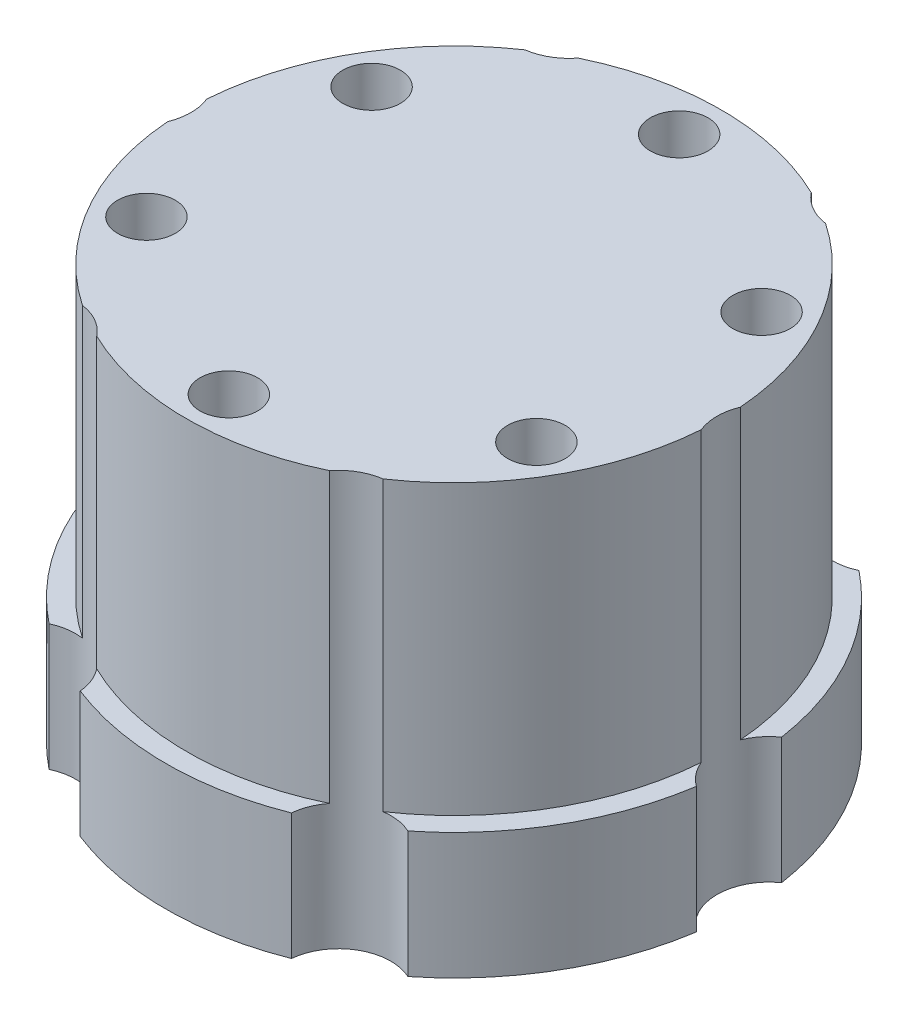
ISO-10303-21;
HEADER;
FILE_DESCRIPTION(('STEP AP214'),'2;1');
FILE_NAME('part.step','',(''),(''),'','','');
FILE_SCHEMA(('AUTOMOTIVE_DESIGN { 1 0 10303 214 1 1 1 1 }'));
ENDSEC;
DATA;
#1=APPLICATION_CONTEXT('core data for automotive mechanical design processes');
#2=APPLICATION_PROTOCOL_DEFINITION('international standard','automotive_design',2000,#1);
#3=PRODUCT_CONTEXT('',#1,'mechanical');
#4=PRODUCT('Part','Part','',(#3));
#5=PRODUCT_RELATED_PRODUCT_CATEGORY('part','',(#4));
#6=PRODUCT_DEFINITION_FORMATION('','',#4);
#7=PRODUCT_DEFINITION_CONTEXT('part definition',#1,'design');
#8=PRODUCT_DEFINITION('design','',#6,#7);
#9=PRODUCT_DEFINITION_SHAPE('','',#8);
#10=(LENGTH_UNIT() NAMED_UNIT(*) SI_UNIT(.MILLI.,.METRE.));
#11=(NAMED_UNIT(*) PLANE_ANGLE_UNIT() SI_UNIT($,.RADIAN.));
#12=(NAMED_UNIT(*) SI_UNIT($,.STERADIAN.) SOLID_ANGLE_UNIT());
#13=UNCERTAINTY_MEASURE_WITH_UNIT(LENGTH_MEASURE(1.E-05),#10,'distance_accuracy_value','');
#14=(GEOMETRIC_REPRESENTATION_CONTEXT(3) GLOBAL_UNCERTAINTY_ASSIGNED_CONTEXT((#13)) GLOBAL_UNIT_ASSIGNED_CONTEXT((#10,
#11,#12)) REPRESENTATION_CONTEXT('',''));
#15=CARTESIAN_POINT('',(0.,0.,0.));
#16=DIRECTION('',(0.,0.,1.));
#17=DIRECTION('',(1.,0.,0.));
#18=AXIS2_PLACEMENT_3D('',#15,#16,#17);
#19=CARTESIAN_POINT('',(0.,7.,0.));
#20=DIRECTION('',(0.,-1.,0.));
#21=DIRECTION('',(0.,0.,-1.));
#22=AXIS2_PLACEMENT_3D('',#19,#20,#21);
#23=CYLINDRICAL_SURFACE('',#22,16.);
#24=CARTESIAN_POINT('',(0.,0.,0.));
#25=DIRECTION('',(0.,1.,0.));
#26=DIRECTION('',(0.,0.,1.));
#27=AXIS2_PLACEMENT_3D('',#24,#25,#26);
#28=CIRCLE('',#27,16.);
#29=CARTESIAN_POINT('',(-15.824,0.,2.36664826283945));
#30=VERTEX_POINT('',#29);
#31=CARTESIAN_POINT('',(-9.96157751744089,0.,12.5206618580655));
#32=VERTEX_POINT('',#31);
#33=EDGE_CURVE('E242',#30,#32,#28,.T.);
#34=ORIENTED_EDGE('',*,*,#33,.T.);
#35=DIRECTION('',(0.,-1.,0.));
#36=VECTOR('',#35,1.);
#37=CARTESIAN_POINT('',(-9.96157751744089,11.5,12.5206618580655));
#38=LINE('',#37,#36);
#39=CARTESIAN_POINT('',(-9.96157751744088,7.,12.5206618580655));
#40=VERTEX_POINT('',#39);
#41=EDGE_CURVE('E287',#32,#40,#38,.F.);
#42=ORIENTED_EDGE('',*,*,#41,.T.);
#43=CARTESIAN_POINT('',(0.,7.,0.));
#44=DIRECTION('',(0.,1.,0.));
#45=DIRECTION('',(0.,0.,1.));
#46=AXIS2_PLACEMENT_3D('',#43,#44,#45);
#47=CIRCLE('',#46,16.);
#48=CARTESIAN_POINT('',(-15.824,7.,2.36664826283945));
#49=VERTEX_POINT('',#48);
#50=EDGE_CURVE('E404',#49,#40,#47,.T.);
#51=ORIENTED_EDGE('',*,*,#50,.F.);
#52=DIRECTION('',(0.,-1.,0.));
#53=VECTOR('',#52,1.);
#54=CARTESIAN_POINT('',(-15.824,11.5,2.36664826283945));
#55=LINE('',#54,#53);
#56=EDGE_CURVE('E267',#49,#30,#55,.T.);
#57=ORIENTED_EDGE('',*,*,#56,.T.);
#58=EDGE_LOOP('',(#34,#42,#51,#57));
#59=FACE_BOUND('',#58,.T.);
#60=ADVANCED_FACE('F41',(#59),#23,.T.);
#61=CARTESIAN_POINT('',(-9.96157751744123,0.,-12.5206618580652));
#62=VERTEX_POINT('',#61);
#63=CARTESIAN_POINT('',(-15.824,0.,-2.36664826283902));
#64=VERTEX_POINT('',#63);
#65=EDGE_CURVE('E412',#62,#64,#28,.T.);
#66=ORIENTED_EDGE('',*,*,#65,.T.);
#67=DIRECTION('',(0.,-1.,0.));
#68=VECTOR('',#67,1.);
#69=CARTESIAN_POINT('',(-15.824,11.5,-2.36664826283902));
#70=LINE('',#69,#68);
#71=CARTESIAN_POINT('',(-15.824,7.,-2.36664826283901));
#72=VERTEX_POINT('',#71);
#73=EDGE_CURVE('E269',#64,#72,#70,.F.);
#74=ORIENTED_EDGE('',*,*,#73,.T.);
#75=CARTESIAN_POINT('',(-9.96157751744122,7.,-12.5206618580652));
#76=VERTEX_POINT('',#75);
#77=EDGE_CURVE('E498',#76,#72,#47,.T.);
#78=ORIENTED_EDGE('',*,*,#77,.F.);
#79=DIRECTION('',(0.,-1.,0.));
#80=VECTOR('',#79,1.);
#81=CARTESIAN_POINT('',(-9.96157751744123,11.5,-12.5206618580652));
#82=LINE('',#81,#80);
#83=EDGE_CURVE('E470',#76,#62,#82,.T.);
#84=ORIENTED_EDGE('',*,*,#83,.T.);
#85=EDGE_LOOP('',(#66,#74,#78,#84));
#86=FACE_BOUND('',#85,.T.);
#87=ADVANCED_FACE('F355',(#86),#23,.T.);
#88=CARTESIAN_POINT('',(5.86242248255877,0.,-14.8873101209046));
#89=VERTEX_POINT('',#88);
#90=CARTESIAN_POINT('',(-5.86242248255907,0.,-14.8873101209045));
#91=VERTEX_POINT('',#90);
#92=EDGE_CURVE('E407',#89,#91,#28,.T.);
#93=ORIENTED_EDGE('',*,*,#92,.T.);
#94=DIRECTION('',(0.,-1.,0.));
#95=VECTOR('',#94,1.);
#96=CARTESIAN_POINT('',(-5.86242248255907,11.5,-14.8873101209045));
#97=LINE('',#96,#95);
#98=CARTESIAN_POINT('',(-5.86242248255908,7.,-14.8873101209045));
#99=VERTEX_POINT('',#98);
#100=EDGE_CURVE('E476',#91,#99,#97,.F.);
#101=ORIENTED_EDGE('',*,*,#100,.T.);
#102=CARTESIAN_POINT('',(5.86242248255878,7.,-14.8873101209046));
#103=VERTEX_POINT('',#102);
#104=EDGE_CURVE('E492',#103,#99,#47,.T.);
#105=ORIENTED_EDGE('',*,*,#104,.F.);
#106=DIRECTION('',(0.,-1.,0.));
#107=VECTOR('',#106,1.);
#108=CARTESIAN_POINT('',(5.86242248255877,11.5,-14.8873101209046));
#109=LINE('',#108,#107);
#110=EDGE_CURVE('E459',#103,#89,#109,.T.);
#111=ORIENTED_EDGE('',*,*,#110,.T.);
#112=EDGE_LOOP('',(#93,#101,#105,#111));
#113=FACE_BOUND('',#112,.T.);
#114=ADVANCED_FACE('F361',(#113),#23,.T.);
#115=CARTESIAN_POINT('',(15.824,0.,-2.36664826283935));
#116=VERTEX_POINT('',#115);
#117=CARTESIAN_POINT('',(9.96157751744098,0.,-12.5206618580654));
#118=VERTEX_POINT('',#117);
#119=EDGE_CURVE('E402',#116,#118,#28,.T.);
#120=ORIENTED_EDGE('',*,*,#119,.T.);
#121=DIRECTION('',(0.,-1.,0.));
#122=VECTOR('',#121,1.);
#123=CARTESIAN_POINT('',(9.96157751744098,11.5,-12.5206618580654));
#124=LINE('',#123,#122);
#125=CARTESIAN_POINT('',(9.96157751744097,7.,-12.5206618580654));
#126=VERTEX_POINT('',#125);
#127=EDGE_CURVE('E465',#118,#126,#124,.F.);
#128=ORIENTED_EDGE('',*,*,#127,.T.);
#129=CARTESIAN_POINT('',(15.824,7.,-2.36664826283934));
#130=VERTEX_POINT('',#129);
#131=EDGE_CURVE('E488',#130,#126,#47,.T.);
#132=ORIENTED_EDGE('',*,*,#131,.F.);
#133=DIRECTION('',(0.,-1.,0.));
#134=VECTOR('',#133,1.);
#135=CARTESIAN_POINT('',(15.824,11.5,-2.36664826283935));
#136=LINE('',#135,#134);
#137=EDGE_CURVE('E447',#130,#116,#136,.T.);
#138=ORIENTED_EDGE('',*,*,#137,.T.);
#139=EDGE_LOOP('',(#120,#128,#132,#138));
#140=FACE_BOUND('',#139,.T.);
#141=ADVANCED_FACE('F382',(#140),#23,.T.);
#142=CARTESIAN_POINT('',(9.96157751744114,0.,12.5206618580653));
#143=VERTEX_POINT('',#142);
#144=CARTESIAN_POINT('',(15.824,0.,2.36664826283913));
#145=VERTEX_POINT('',#144);
#146=EDGE_CURVE('E243',#143,#145,#28,.T.);
#147=ORIENTED_EDGE('',*,*,#146,.T.);
#148=DIRECTION('',(0.,-1.,0.));
#149=VECTOR('',#148,1.);
#150=CARTESIAN_POINT('',(15.824,11.5,2.36664826283913));
#151=LINE('',#150,#149);
#152=CARTESIAN_POINT('',(15.824,7.,2.36664826283912));
#153=VERTEX_POINT('',#152);
#154=EDGE_CURVE('E396',#145,#153,#151,.F.);
#155=ORIENTED_EDGE('',*,*,#154,.T.);
#156=CARTESIAN_POINT('',(9.96157751744114,7.,12.5206618580653));
#157=VERTEX_POINT('',#156);
#158=EDGE_CURVE('E405',#157,#153,#47,.T.);
#159=ORIENTED_EDGE('',*,*,#158,.F.);
#160=DIRECTION('',(0.,-1.,0.));
#161=VECTOR('',#160,1.);
#162=CARTESIAN_POINT('',(9.96157751744114,11.5,12.5206618580653));
#163=LINE('',#162,#161);
#164=EDGE_CURVE('E224',#157,#143,#163,.T.);
#165=ORIENTED_EDGE('',*,*,#164,.T.);
#166=EDGE_LOOP('',(#147,#155,#159,#165));
#167=FACE_BOUND('',#166,.T.);
#168=ADVANCED_FACE('F368',(#167),#23,.T.);
#169=CARTESIAN_POINT('',(0.,7.,0.));
#170=DIRECTION('',(0.,1.,0.));
#171=DIRECTION('',(0.,0.,1.));
#172=AXIS2_PLACEMENT_3D('',#169,#170,#171);
#173=PLANE('',#172);
#174=CARTESIAN_POINT('',(-8.74999999999975,7.,15.1554445662278));
#175=DIRECTION('',(0.,1.,0.));
#176=DIRECTION('',(0.,0.,1.));
#177=AXIS2_PLACEMENT_3D('',#174,#175,#176);
#178=CIRCLE('',#177,2.9);
#179=CARTESIAN_POINT('',(-5.86242248255867,7.,14.8873101209047));
#180=VERTEX_POINT('',#179);
#181=CARTESIAN_POINT('',(-6.46610137770818,7.,13.3683219954189));
#182=VERTEX_POINT('',#181);
#183=EDGE_CURVE('E278',#180,#182,#178,.T.);
#184=ORIENTED_EDGE('',*,*,#183,.F.);
#185=CARTESIAN_POINT('',(5.86242248255898,7.,14.8873101209045));
#186=VERTEX_POINT('',#185);
#187=EDGE_CURVE('E401',#180,#186,#47,.T.);
#188=ORIENTED_EDGE('',*,*,#187,.T.);
#189=CARTESIAN_POINT('',(8.75000000000007,7.,15.1554445662276));
#190=DIRECTION('',(0.,1.,0.));
#191=DIRECTION('',(0.,0.,1.));
#192=AXIS2_PLACEMENT_3D('',#189,#190,#191);
#193=CIRCLE('',#192,2.9);
#194=CARTESIAN_POINT('',(6.4661013777085,7.,13.3683219954187));
#195=VERTEX_POINT('',#194);
#196=EDGE_CURVE('E223',#195,#186,#193,.T.);
#197=ORIENTED_EDGE('',*,*,#196,.F.);
#198=CARTESIAN_POINT('',(0.,7.,0.));
#199=DIRECTION('',(0.,1.,0.));
#200=DIRECTION('',(0.,0.,1.));
#201=AXIS2_PLACEMENT_3D('',#198,#199,#200);
#202=CIRCLE('',#201,14.85);
#203=EDGE_CURVE('E52',#182,#195,#202,.T.);
#204=ORIENTED_EDGE('',*,*,#203,.F.);
#205=EDGE_LOOP('',(#184,#188,#197,#204));
#206=FACE_BOUND('',#205,.T.);
#207=ADVANCED_FACE('F375',(#206),#173,.T.);
#208=CARTESIAN_POINT('',(-8.34425576514854,7.,12.2839690542506));
#209=VERTEX_POINT('',#208);
#210=EDGE_CURVE('E281',#209,#40,#178,.T.);
#211=ORIENTED_EDGE('',*,*,#210,.F.);
#212=CARTESIAN_POINT('',(-14.8103571428571,7.,1.08435294116852));
#213=VERTEX_POINT('',#212);
#214=EDGE_CURVE('E485',#213,#209,#202,.T.);
#215=ORIENTED_EDGE('',*,*,#214,.F.);
#216=CARTESIAN_POINT('',(-17.5,7.,2.39391839684799E-13));
#217=DIRECTION('',(0.,1.,0.));
#218=DIRECTION('',(0.,0.,1.));
#219=AXIS2_PLACEMENT_3D('',#216,#217,#218);
#220=CIRCLE('',#219,2.9);
#221=EDGE_CURVE('E271',#49,#213,#220,.T.);
#222=ORIENTED_EDGE('',*,*,#221,.F.);
#223=ORIENTED_EDGE('',*,*,#50,.T.);
#224=EDGE_LOOP('',(#211,#215,#222,#223));
#225=FACE_BOUND('',#224,.T.);
#226=ADVANCED_FACE('F388',(#225),#173,.T.);
#227=CARTESIAN_POINT('',(-8.75000000000017,7.,-15.1554445662276));
#228=DIRECTION('',(0.,1.,0.));
#229=DIRECTION('',(0.,0.,1.));
#230=AXIS2_PLACEMENT_3D('',#227,#228,#229);
#231=CIRCLE('',#230,2.9);
#232=CARTESIAN_POINT('',(-6.4661013777086,7.,-13.3683219954187));
#233=VERTEX_POINT('',#232);
#234=EDGE_CURVE('E471',#233,#99,#231,.T.);
#235=ORIENTED_EDGE('',*,*,#234,.F.);
#236=CARTESIAN_POINT('',(6.46610137770832,7.,-13.3683219954188));
#237=VERTEX_POINT('',#236);
#238=EDGE_CURVE('E487',#237,#233,#202,.T.);
#239=ORIENTED_EDGE('',*,*,#238,.F.);
#240=CARTESIAN_POINT('',(8.74999999999986,7.,-15.1554445662278));
#241=DIRECTION('',(0.,1.,0.));
#242=DIRECTION('',(0.,0.,1.));
#243=AXIS2_PLACEMENT_3D('',#240,#241,#242);
#244=CIRCLE('',#243,2.9);
#245=EDGE_CURVE('E457',#103,#237,#244,.T.);
#246=ORIENTED_EDGE('',*,*,#245,.F.);
#247=ORIENTED_EDGE('',*,*,#104,.T.);
#248=EDGE_LOOP('',(#235,#239,#246,#247));
#249=FACE_BOUND('',#248,.T.);
#250=ADVANCED_FACE('F528',(#249),#173,.T.);
#251=CARTESIAN_POINT('',(-14.8103571428572,7.,-1.08435294116811));
#252=VERTEX_POINT('',#251);
#253=EDGE_CURVE('E266',#252,#72,#220,.T.);
#254=ORIENTED_EDGE('',*,*,#253,.F.);
#255=CARTESIAN_POINT('',(-8.34425576514885,7.,-12.2839690542504));
#256=VERTEX_POINT('',#255);
#257=EDGE_CURVE('E264',#256,#252,#202,.T.);
#258=ORIENTED_EDGE('',*,*,#257,.F.);
#259=EDGE_CURVE('E468',#76,#256,#231,.T.);
#260=ORIENTED_EDGE('',*,*,#259,.F.);
#261=ORIENTED_EDGE('',*,*,#77,.T.);
#262=EDGE_LOOP('',(#254,#258,#260,#261));
#263=FACE_BOUND('',#262,.T.);
#264=ADVANCED_FACE('F507',(#263),#173,.T.);
#265=CARTESIAN_POINT('',(8.3442557651486,7.,-12.2839690542505));
#266=VERTEX_POINT('',#265);
#267=EDGE_CURVE('E460',#266,#126,#244,.T.);
#268=ORIENTED_EDGE('',*,*,#267,.F.);
#269=CARTESIAN_POINT('',(14.8103571428571,7.,-1.08435294116842));
#270=VERTEX_POINT('',#269);
#271=EDGE_CURVE('E50',#270,#266,#202,.T.);
#272=ORIENTED_EDGE('',*,*,#271,.F.);
#273=CARTESIAN_POINT('',(17.5,7.,-1.18828558104411E-13));
#274=DIRECTION('',(0.,1.,0.));
#275=DIRECTION('',(0.,0.,1.));
#276=AXIS2_PLACEMENT_3D('',#273,#274,#275);
#277=CIRCLE('',#276,2.9);
#278=EDGE_CURVE('E445',#130,#270,#277,.T.);
#279=ORIENTED_EDGE('',*,*,#278,.F.);
#280=ORIENTED_EDGE('',*,*,#131,.T.);
#281=EDGE_LOOP('',(#268,#272,#279,#280));
#282=FACE_BOUND('',#281,.T.);
#283=ADVANCED_FACE('F376',(#282),#173,.T.);
#284=CARTESIAN_POINT('',(0.,23.,0.));
#285=DIRECTION('',(0.,-1.,0.));
#286=DIRECTION('',(0.,0.,-1.));
#287=AXIS2_PLACEMENT_3D('',#284,#285,#286);
#288=CYLINDRICAL_SURFACE('',#287,14.85);
#289=ORIENTED_EDGE('',*,*,#214,.T.);
#290=DIRECTION('',(0.,-1.,0.));
#291=VECTOR('',#290,1.);
#292=CARTESIAN_POINT('',(-8.34425576514855,11.5,12.2839690542506));
#293=LINE('',#292,#291);
#294=CARTESIAN_POINT('',(-8.34425576514855,23.,12.2839690542506));
#295=VERTEX_POINT('',#294);
#296=EDGE_CURVE('E284',#209,#295,#293,.F.);
#297=ORIENTED_EDGE('',*,*,#296,.T.);
#298=CARTESIAN_POINT('',(0.,23.,0.));
#299=DIRECTION('',(0.,1.,0.));
#300=DIRECTION('',(0.,0.,1.));
#301=AXIS2_PLACEMENT_3D('',#298,#299,#300);
#302=CIRCLE('',#301,14.85);
#303=CARTESIAN_POINT('',(-14.8103571428571,23.,1.08435294116852));
#304=VERTEX_POINT('',#303);
#305=EDGE_CURVE('E230',#304,#295,#302,.T.);
#306=ORIENTED_EDGE('',*,*,#305,.F.);
#307=DIRECTION('',(0.,-1.,0.));
#308=VECTOR('',#307,1.);
#309=CARTESIAN_POINT('',(-14.8103571428571,11.5,1.08435294116852));
#310=LINE('',#309,#308);
#311=EDGE_CURVE('E67',#304,#213,#310,.T.);
#312=ORIENTED_EDGE('',*,*,#311,.T.);
#313=EDGE_LOOP('',(#289,#297,#306,#312));
#314=FACE_BOUND('',#313,.T.);
#315=ADVANCED_FACE('F484',(#314),#288,.T.);
#316=ORIENTED_EDGE('',*,*,#257,.T.);
#317=DIRECTION('',(0.,-1.,0.));
#318=VECTOR('',#317,1.);
#319=CARTESIAN_POINT('',(-14.8103571428572,11.5,-1.08435294116811));
#320=LINE('',#319,#318);
#321=CARTESIAN_POINT('',(-14.8103571428572,23.,-1.08435294116811));
#322=VERTEX_POINT('',#321);
#323=EDGE_CURVE('E263',#252,#322,#320,.F.);
#324=ORIENTED_EDGE('',*,*,#323,.T.);
#325=CARTESIAN_POINT('',(-8.34425576514884,23.,-12.2839690542504));
#326=VERTEX_POINT('',#325);
#327=EDGE_CURVE('E234',#326,#322,#302,.T.);
#328=ORIENTED_EDGE('',*,*,#327,.F.);
#329=DIRECTION('',(0.,-1.,0.));
#330=VECTOR('',#329,1.);
#331=CARTESIAN_POINT('',(-8.34425576514884,11.5,-12.2839690542503));
#332=LINE('',#331,#330);
#333=EDGE_CURVE('E261',#326,#256,#332,.T.);
#334=ORIENTED_EDGE('',*,*,#333,.T.);
#335=EDGE_LOOP('',(#316,#324,#328,#334));
#336=FACE_BOUND('',#335,.T.);
#337=ADVANCED_FACE('F260',(#336),#288,.T.);
#338=ORIENTED_EDGE('',*,*,#238,.T.);
#339=DIRECTION('',(0.,-1.,0.));
#340=VECTOR('',#339,1.);
#341=CARTESIAN_POINT('',(-6.46610137770859,11.5,-13.3683219954187));
#342=LINE('',#341,#340);
#343=CARTESIAN_POINT('',(-6.46610137770859,23.,-13.3683219954187));
#344=VERTEX_POINT('',#343);
#345=EDGE_CURVE('E473',#233,#344,#342,.F.);
#346=ORIENTED_EDGE('',*,*,#345,.T.);
#347=CARTESIAN_POINT('',(6.46610137770832,23.,-13.3683219954188));
#348=VERTEX_POINT('',#347);
#349=EDGE_CURVE('E245',#348,#344,#302,.T.);
#350=ORIENTED_EDGE('',*,*,#349,.F.);
#351=DIRECTION('',(0.,-1.,0.));
#352=VECTOR('',#351,1.);
#353=CARTESIAN_POINT('',(6.46610137770831,11.5,-13.3683219954188));
#354=LINE('',#353,#352);
#355=EDGE_CURVE('E454',#348,#237,#354,.T.);
#356=ORIENTED_EDGE('',*,*,#355,.T.);
#357=EDGE_LOOP('',(#338,#346,#350,#356));
#358=FACE_BOUND('',#357,.T.);
#359=ADVANCED_FACE('F530',(#358),#288,.T.);
#360=ORIENTED_EDGE('',*,*,#271,.T.);
#361=DIRECTION('',(0.,-1.,0.));
#362=VECTOR('',#361,1.);
#363=CARTESIAN_POINT('',(8.34425576514859,11.5,-12.2839690542505));
#364=LINE('',#363,#362);
#365=CARTESIAN_POINT('',(8.34425576514859,23.,-12.2839690542505));
#366=VERTEX_POINT('',#365);
#367=EDGE_CURVE('E462',#266,#366,#364,.F.);
#368=ORIENTED_EDGE('',*,*,#367,.T.);
#369=CARTESIAN_POINT('',(14.8103571428571,23.,-1.08435294116841));
#370=VERTEX_POINT('',#369);
#371=EDGE_CURVE('E239',#370,#366,#302,.T.);
#372=ORIENTED_EDGE('',*,*,#371,.F.);
#373=DIRECTION('',(0.,-1.,0.));
#374=VECTOR('',#373,1.);
#375=CARTESIAN_POINT('',(14.8103571428571,11.5,-1.08435294116842));
#376=LINE('',#375,#374);
#377=EDGE_CURVE('E442',#370,#270,#376,.T.);
#378=ORIENTED_EDGE('',*,*,#377,.T.);
#379=EDGE_LOOP('',(#360,#368,#372,#378));
#380=FACE_BOUND('',#379,.T.);
#381=ADVANCED_FACE('F377',(#380),#288,.T.);
#382=CARTESIAN_POINT('',(8.34425576514877,7.,12.2839690542504));
#383=VERTEX_POINT('',#382);
#384=CARTESIAN_POINT('',(14.8103571428572,7.,1.08435294116822));
#385=VERTEX_POINT('',#384);
#386=EDGE_CURVE('E11',#383,#385,#202,.T.);
#387=ORIENTED_EDGE('',*,*,#386,.T.);
#388=DIRECTION('',(0.,-1.,0.));
#389=VECTOR('',#388,1.);
#390=CARTESIAN_POINT('',(14.8103571428571,11.5,1.08435294116822));
#391=LINE('',#390,#389);
#392=CARTESIAN_POINT('',(14.8103571428571,23.,1.08435294116822));
#393=VERTEX_POINT('',#392);
#394=EDGE_CURVE('E450',#385,#393,#391,.F.);
#395=ORIENTED_EDGE('',*,*,#394,.T.);
#396=CARTESIAN_POINT('',(8.34425576514876,23.,12.2839690542504));
#397=VERTEX_POINT('',#396);
#398=EDGE_CURVE('E233',#397,#393,#302,.T.);
#399=ORIENTED_EDGE('',*,*,#398,.F.);
#400=DIRECTION('',(0.,-1.,0.));
#401=VECTOR('',#400,1.);
#402=CARTESIAN_POINT('',(8.34425576514876,11.5,12.2839690542504));
#403=LINE('',#402,#401);
#404=EDGE_CURVE('E210',#397,#383,#403,.T.);
#405=ORIENTED_EDGE('',*,*,#404,.T.);
#406=EDGE_LOOP('',(#387,#395,#399,#405));
#407=FACE_BOUND('',#406,.T.);
#408=ADVANCED_FACE('F366',(#407),#288,.T.);
#409=ORIENTED_EDGE('',*,*,#187,.F.);
#410=DIRECTION('',(0.,-1.,0.));
#411=VECTOR('',#410,1.);
#412=CARTESIAN_POINT('',(-5.86242248255866,11.5,14.8873101209047));
#413=LINE('',#412,#411);
#414=CARTESIAN_POINT('',(-5.86242248255866,0.,14.8873101209047));
#415=VERTEX_POINT('',#414);
#416=EDGE_CURVE('E280',#180,#415,#413,.T.);
#417=ORIENTED_EDGE('',*,*,#416,.T.);
#418=CARTESIAN_POINT('',(5.86242248255897,0.,14.8873101209045));
#419=VERTEX_POINT('',#418);
#420=EDGE_CURVE('E45',#415,#419,#28,.T.);
#421=ORIENTED_EDGE('',*,*,#420,.T.);
#422=DIRECTION('',(0.,-1.,0.));
#423=VECTOR('',#422,1.);
#424=CARTESIAN_POINT('',(5.86242248255897,11.5,14.8873101209045));
#425=LINE('',#424,#423);
#426=EDGE_CURVE('E439',#419,#186,#425,.F.);
#427=ORIENTED_EDGE('',*,*,#426,.T.);
#428=EDGE_LOOP('',(#409,#417,#421,#427));
#429=FACE_BOUND('',#428,.T.);
#430=ADVANCED_FACE('F43',(#429),#23,.T.);
#431=EDGE_CURVE('E448',#385,#153,#277,.T.);
#432=ORIENTED_EDGE('',*,*,#431,.F.);
#433=ORIENTED_EDGE('',*,*,#386,.F.);
#434=EDGE_CURVE('E436',#157,#383,#193,.T.);
#435=ORIENTED_EDGE('',*,*,#434,.F.);
#436=ORIENTED_EDGE('',*,*,#158,.T.);
#437=EDGE_LOOP('',(#432,#433,#435,#436));
#438=FACE_BOUND('',#437,.T.);
#439=ADVANCED_FACE('F365',(#438),#173,.T.);
#440=CARTESIAN_POINT('',(0.,0.,0.));
#441=DIRECTION('',(0.,1.,0.));
#442=DIRECTION('',(0.,0.,1.));
#443=AXIS2_PLACEMENT_3D('',#440,#441,#442);
#444=PLANE('',#443);
#445=CARTESIAN_POINT('',(0.,0.,-12.5));
#446=DIRECTION('',(0.,1.,0.));
#447=DIRECTION('',(0.,0.,1.));
#448=AXIS2_PLACEMENT_3D('',#445,#446,#447);
#449=CIRCLE('',#448,1.6);
#450=CARTESIAN_POINT('',(0.,0.,-10.9));
#451=VERTEX_POINT('',#450);
#452=EDGE_CURVE('E231',#451,#451,#449,.T.);
#453=ORIENTED_EDGE('',*,*,#452,.T.);
#454=EDGE_LOOP('',(#453));
#455=FACE_BOUND('',#454,.T.);
#456=CARTESIAN_POINT('',(-10.8253175473054,0.,-6.25000000000013));
#457=DIRECTION('',(0.,1.,0.));
#458=DIRECTION('',(0.,0.,1.));
#459=AXIS2_PLACEMENT_3D('',#456,#457,#458);
#460=CIRCLE('',#459,1.6);
#461=CARTESIAN_POINT('',(-10.8253175473054,0.,-4.65000000000013));
#462=VERTEX_POINT('',#461);
#463=EDGE_CURVE('E289',#462,#462,#460,.T.);
#464=ORIENTED_EDGE('',*,*,#463,.T.);
#465=EDGE_LOOP('',(#464));
#466=FACE_BOUND('',#465,.T.);
#467=CARTESIAN_POINT('',(-10.8253175473055,0.,6.2499999999999));
#468=DIRECTION('',(0.,1.,0.));
#469=DIRECTION('',(0.,0.,1.));
#470=AXIS2_PLACEMENT_3D('',#467,#468,#469);
#471=CIRCLE('',#470,1.6);
#472=CARTESIAN_POINT('',(-10.8253175473055,0.,7.8499999999999));
#473=VERTEX_POINT('',#472);
#474=EDGE_CURVE('E297',#473,#473,#471,.T.);
#475=ORIENTED_EDGE('',*,*,#474,.T.);
#476=EDGE_LOOP('',(#475));
#477=FACE_BOUND('',#476,.T.);
#478=CARTESIAN_POINT('',(0.,0.,12.5));
#479=DIRECTION('',(0.,1.,0.));
#480=DIRECTION('',(0.,0.,1.));
#481=AXIS2_PLACEMENT_3D('',#478,#479,#480);
#482=CIRCLE('',#481,1.6);
#483=CARTESIAN_POINT('',(0.,0.,14.1));
#484=VERTEX_POINT('',#483);
#485=EDGE_CURVE('E314',#484,#484,#482,.T.);
#486=ORIENTED_EDGE('',*,*,#485,.T.);
#487=EDGE_LOOP('',(#486));
#488=FACE_BOUND('',#487,.T.);
#489=CARTESIAN_POINT('',(10.8253175473055,0.,6.25000000000005));
#490=DIRECTION('',(0.,1.,0.));
#491=DIRECTION('',(0.,0.,1.));
#492=AXIS2_PLACEMENT_3D('',#489,#490,#491);
#493=CIRCLE('',#492,1.6);
#494=CARTESIAN_POINT('',(10.8253175473055,0.,7.85000000000005));
#495=VERTEX_POINT('',#494);
#496=EDGE_CURVE('E308',#495,#495,#493,.T.);
#497=ORIENTED_EDGE('',*,*,#496,.T.);
#498=EDGE_LOOP('',(#497));
#499=FACE_BOUND('',#498,.T.);
#500=CARTESIAN_POINT('',(10.8253175473055,0.,-6.24999999999998));
#501=DIRECTION('',(0.,1.,0.));
#502=DIRECTION('',(0.,0.,1.));
#503=AXIS2_PLACEMENT_3D('',#500,#501,#502);
#504=CIRCLE('',#503,1.6);
#505=CARTESIAN_POINT('',(10.8253175473055,0.,-4.64999999999998));
#506=VERTEX_POINT('',#505);
#507=EDGE_CURVE('E302',#506,#506,#504,.T.);
#508=ORIENTED_EDGE('',*,*,#507,.T.);
#509=EDGE_LOOP('',(#508));
#510=FACE_BOUND('',#509,.T.);
#511=ORIENTED_EDGE('',*,*,#420,.F.);
#512=CARTESIAN_POINT('',(-8.74999999999975,0.,15.1554445662278));
#513=DIRECTION('',(0.,-1.,0.));
#514=DIRECTION('',(0.,0.,-1.));
#515=AXIS2_PLACEMENT_3D('',#512,#513,#514);
#516=CIRCLE('',#515,2.9);
#517=EDGE_CURVE('E427',#32,#415,#516,.T.);
#518=ORIENTED_EDGE('',*,*,#517,.F.);
#519=ORIENTED_EDGE('',*,*,#33,.F.);
#520=CARTESIAN_POINT('',(-17.5,0.,2.39391839684799E-13));
#521=DIRECTION('',(0.,-1.,0.));
#522=DIRECTION('',(0.,0.,-1.));
#523=AXIS2_PLACEMENT_3D('',#520,#521,#522);
#524=CIRCLE('',#523,2.9);
#525=EDGE_CURVE('E426',#64,#30,#524,.T.);
#526=ORIENTED_EDGE('',*,*,#525,.F.);
#527=ORIENTED_EDGE('',*,*,#65,.F.);
#528=CARTESIAN_POINT('',(-8.75000000000017,0.,-15.1554445662276));
#529=DIRECTION('',(0.,-1.,0.));
#530=DIRECTION('',(0.,0.,-1.));
#531=AXIS2_PLACEMENT_3D('',#528,#529,#530);
#532=CIRCLE('',#531,2.9);
#533=EDGE_CURVE('E508',#91,#62,#532,.T.);
#534=ORIENTED_EDGE('',*,*,#533,.F.);
#535=ORIENTED_EDGE('',*,*,#92,.F.);
#536=CARTESIAN_POINT('',(8.74999999999986,0.,-15.1554445662278));
#537=DIRECTION('',(0.,-1.,0.));
#538=DIRECTION('',(0.,0.,-1.));
#539=AXIS2_PLACEMENT_3D('',#536,#537,#538);
#540=CIRCLE('',#539,2.9);
#541=EDGE_CURVE('E514',#118,#89,#540,.T.);
#542=ORIENTED_EDGE('',*,*,#541,.F.);
#543=ORIENTED_EDGE('',*,*,#119,.F.);
#544=CARTESIAN_POINT('',(17.5,0.,-1.18828558104411E-13));
#545=DIRECTION('',(0.,-1.,0.));
#546=DIRECTION('',(0.,0.,-1.));
#547=AXIS2_PLACEMENT_3D('',#544,#545,#546);
#548=CIRCLE('',#547,2.9);
#549=EDGE_CURVE('E434',#145,#116,#548,.T.);
#550=ORIENTED_EDGE('',*,*,#549,.F.);
#551=ORIENTED_EDGE('',*,*,#146,.F.);
#552=CARTESIAN_POINT('',(8.75000000000007,0.,15.1554445662276));
#553=DIRECTION('',(0.,-1.,0.));
#554=DIRECTION('',(0.,0.,-1.));
#555=AXIS2_PLACEMENT_3D('',#552,#553,#554);
#556=CIRCLE('',#555,2.9);
#557=EDGE_CURVE('E215',#419,#143,#556,.T.);
#558=ORIENTED_EDGE('',*,*,#557,.F.);
#559=EDGE_LOOP('',(#511,#518,#519,#526,#527,#534,#535,#542,#543,#550,#551,#558));
#560=FACE_BOUND('',#559,.T.);
#561=ADVANCED_FACE('F322',(#455,#466,#477,#488,#499,#510,#560),#444,.F.);
#562=CARTESIAN_POINT('',(-6.46610137770818,23.,13.3683219954189));
#563=VERTEX_POINT('',#562);
#564=CARTESIAN_POINT('',(6.4661013777085,23.,13.3683219954187));
#565=VERTEX_POINT('',#564);
#566=EDGE_CURVE('E221',#563,#565,#302,.T.);
#567=ORIENTED_EDGE('',*,*,#566,.F.);
#568=DIRECTION('',(0.,-1.,0.));
#569=VECTOR('',#568,1.);
#570=CARTESIAN_POINT('',(-6.46610137770819,11.5,13.3683219954189));
#571=LINE('',#570,#569);
#572=EDGE_CURVE('E59',#563,#182,#571,.T.);
#573=ORIENTED_EDGE('',*,*,#572,.T.);
#574=ORIENTED_EDGE('',*,*,#203,.T.);
#575=DIRECTION('',(0.,-1.,0.));
#576=VECTOR('',#575,1.);
#577=CARTESIAN_POINT('',(6.46610137770849,11.5,13.3683219954187));
#578=LINE('',#577,#576);
#579=EDGE_CURVE('E207',#195,#565,#578,.F.);
#580=ORIENTED_EDGE('',*,*,#579,.T.);
#581=EDGE_LOOP('',(#567,#573,#574,#580));
#582=FACE_BOUND('',#581,.T.);
#583=ADVANCED_FACE('F220',(#582),#288,.T.);
#584=CARTESIAN_POINT('',(0.,23.,0.));
#585=DIRECTION('',(0.,1.,0.));
#586=DIRECTION('',(0.,0.,1.));
#587=AXIS2_PLACEMENT_3D('',#584,#585,#586);
#588=PLANE('',#587);
#589=CARTESIAN_POINT('',(-8.74999999999975,23.,15.1554445662278));
#590=DIRECTION('',(0.,-1.,0.));
#591=DIRECTION('',(0.,0.,-1.));
#592=AXIS2_PLACEMENT_3D('',#589,#590,#591);
#593=CIRCLE('',#592,2.9);
#594=EDGE_CURVE('E229',#295,#563,#593,.T.);
#595=ORIENTED_EDGE('',*,*,#594,.T.);
#596=ORIENTED_EDGE('',*,*,#566,.T.);
#597=CARTESIAN_POINT('',(8.75000000000007,23.,15.1554445662276));
#598=DIRECTION('',(0.,-1.,0.));
#599=DIRECTION('',(0.,0.,-1.));
#600=AXIS2_PLACEMENT_3D('',#597,#598,#599);
#601=CIRCLE('',#600,2.9);
#602=EDGE_CURVE('E204',#565,#397,#601,.T.);
#603=ORIENTED_EDGE('',*,*,#602,.T.);
#604=ORIENTED_EDGE('',*,*,#398,.T.);
#605=CARTESIAN_POINT('',(17.5,23.,-1.18828558104411E-13));
#606=DIRECTION('',(0.,-1.,0.));
#607=DIRECTION('',(0.,0.,-1.));
#608=AXIS2_PLACEMENT_3D('',#605,#606,#607);
#609=CIRCLE('',#608,2.9);
#610=EDGE_CURVE('E516',#393,#370,#609,.T.);
#611=ORIENTED_EDGE('',*,*,#610,.T.);
#612=ORIENTED_EDGE('',*,*,#371,.T.);
#613=CARTESIAN_POINT('',(8.74999999999986,23.,-15.1554445662278));
#614=DIRECTION('',(0.,-1.,0.));
#615=DIRECTION('',(0.,0.,-1.));
#616=AXIS2_PLACEMENT_3D('',#613,#614,#615);
#617=CIRCLE('',#616,2.9);
#618=EDGE_CURVE('E512',#366,#348,#617,.T.);
#619=ORIENTED_EDGE('',*,*,#618,.T.);
#620=ORIENTED_EDGE('',*,*,#349,.T.);
#621=CARTESIAN_POINT('',(-8.75000000000017,23.,-15.1554445662276));
#622=DIRECTION('',(0.,-1.,0.));
#623=DIRECTION('',(0.,0.,-1.));
#624=AXIS2_PLACEMENT_3D('',#621,#622,#623);
#625=CIRCLE('',#624,2.9);
#626=EDGE_CURVE('E255',#344,#326,#625,.T.);
#627=ORIENTED_EDGE('',*,*,#626,.T.);
#628=ORIENTED_EDGE('',*,*,#327,.T.);
#629=CARTESIAN_POINT('',(-17.5,23.,2.39391839684799E-13));
#630=DIRECTION('',(0.,-1.,0.));
#631=DIRECTION('',(0.,0.,-1.));
#632=AXIS2_PLACEMENT_3D('',#629,#630,#631);
#633=CIRCLE('',#632,2.9);
#634=EDGE_CURVE('E253',#322,#304,#633,.T.);
#635=ORIENTED_EDGE('',*,*,#634,.T.);
#636=ORIENTED_EDGE('',*,*,#305,.T.);
#637=EDGE_LOOP('',(#595,#596,#603,#604,#611,#612,#619,#620,#627,#628,#635,#636));
#638=FACE_BOUND('',#637,.T.);
#639=CARTESIAN_POINT('',(0.,23.,-12.5));
#640=DIRECTION('',(0.,1.,0.));
#641=DIRECTION('',(0.,0.,1.));
#642=AXIS2_PLACEMENT_3D('',#639,#640,#641);
#643=CIRCLE('',#642,1.6);
#644=CARTESIAN_POINT('',(0.,23.,-10.9));
#645=VERTEX_POINT('',#644);
#646=EDGE_CURVE('E236',#645,#645,#643,.T.);
#647=ORIENTED_EDGE('',*,*,#646,.F.);
#648=EDGE_LOOP('',(#647));
#649=FACE_BOUND('',#648,.T.);
#650=CARTESIAN_POINT('',(-10.8253175473054,23.,-6.25000000000013));
#651=DIRECTION('',(0.,1.,0.));
#652=DIRECTION('',(0.,0.,1.));
#653=AXIS2_PLACEMENT_3D('',#650,#651,#652);
#654=CIRCLE('',#653,1.6);
#655=CARTESIAN_POINT('',(-10.8253175473054,23.,-4.65000000000013));
#656=VERTEX_POINT('',#655);
#657=EDGE_CURVE('E294',#656,#656,#654,.T.);
#658=ORIENTED_EDGE('',*,*,#657,.F.);
#659=EDGE_LOOP('',(#658));
#660=FACE_BOUND('',#659,.T.);
#661=CARTESIAN_POINT('',(-10.8253175473055,23.,6.2499999999999));
#662=DIRECTION('',(0.,1.,0.));
#663=DIRECTION('',(0.,0.,1.));
#664=AXIS2_PLACEMENT_3D('',#661,#662,#663);
#665=CIRCLE('',#664,1.6);
#666=CARTESIAN_POINT('',(-10.8253175473055,23.,7.8499999999999));
#667=VERTEX_POINT('',#666);
#668=EDGE_CURVE('E317',#667,#667,#665,.T.);
#669=ORIENTED_EDGE('',*,*,#668,.F.);
#670=EDGE_LOOP('',(#669));
#671=FACE_BOUND('',#670,.T.);
#672=CARTESIAN_POINT('',(0.,23.,12.5));
#673=DIRECTION('',(0.,1.,0.));
#674=DIRECTION('',(0.,0.,1.));
#675=AXIS2_PLACEMENT_3D('',#672,#673,#674);
#676=CIRCLE('',#675,1.6);
#677=CARTESIAN_POINT('',(0.,23.,14.1));
#678=VERTEX_POINT('',#677);
#679=EDGE_CURVE('E311',#678,#678,#676,.T.);
#680=ORIENTED_EDGE('',*,*,#679,.F.);
#681=EDGE_LOOP('',(#680));
#682=FACE_BOUND('',#681,.T.);
#683=CARTESIAN_POINT('',(10.8253175473055,23.,6.25000000000005));
#684=DIRECTION('',(0.,1.,0.));
#685=DIRECTION('',(0.,0.,1.));
#686=AXIS2_PLACEMENT_3D('',#683,#684,#685);
#687=CIRCLE('',#686,1.6);
#688=CARTESIAN_POINT('',(10.8253175473055,23.,7.85000000000005));
#689=VERTEX_POINT('',#688);
#690=EDGE_CURVE('E305',#689,#689,#687,.T.);
#691=ORIENTED_EDGE('',*,*,#690,.F.);
#692=EDGE_LOOP('',(#691));
#693=FACE_BOUND('',#692,.T.);
#694=CARTESIAN_POINT('',(10.8253175473055,23.,-6.24999999999998));
#695=DIRECTION('',(0.,1.,0.));
#696=DIRECTION('',(0.,0.,1.));
#697=AXIS2_PLACEMENT_3D('',#694,#695,#696);
#698=CIRCLE('',#697,1.6);
#699=CARTESIAN_POINT('',(10.8253175473055,23.,-4.64999999999998));
#700=VERTEX_POINT('',#699);
#701=EDGE_CURVE('E293',#700,#700,#698,.T.);
#702=ORIENTED_EDGE('',*,*,#701,.F.);
#703=EDGE_LOOP('',(#702));
#704=FACE_BOUND('',#703,.T.);
#705=ADVANCED_FACE('F226',(#638,#649,#660,#671,#682,#693,#704),#588,.T.);
#706=CARTESIAN_POINT('',(10.8253175473055,0.,-6.24999999999998));
#707=DIRECTION('',(0.,1.,0.));
#708=DIRECTION('',(0.,0.,1.));
#709=AXIS2_PLACEMENT_3D('',#706,#707,#708);
#710=CYLINDRICAL_SURFACE('',#709,1.6);
#711=ORIENTED_EDGE('',*,*,#507,.F.);
#712=EDGE_LOOP('',(#711));
#713=FACE_BOUND('',#712,.T.);
#714=ORIENTED_EDGE('',*,*,#701,.T.);
#715=EDGE_LOOP('',(#714));
#716=FACE_BOUND('',#715,.T.);
#717=ADVANCED_FACE('F335',(#713,#716),#710,.F.);
#718=CARTESIAN_POINT('',(10.8253175473055,0.,6.25000000000005));
#719=DIRECTION('',(0.,1.,0.));
#720=DIRECTION('',(0.,0.,1.));
#721=AXIS2_PLACEMENT_3D('',#718,#719,#720);
#722=CYLINDRICAL_SURFACE('',#721,1.6);
#723=ORIENTED_EDGE('',*,*,#496,.F.);
#724=EDGE_LOOP('',(#723));
#725=FACE_BOUND('',#724,.T.);
#726=ORIENTED_EDGE('',*,*,#690,.T.);
#727=EDGE_LOOP('',(#726));
#728=FACE_BOUND('',#727,.T.);
#729=ADVANCED_FACE('F344',(#725,#728),#722,.F.);
#730=CARTESIAN_POINT('',(0.,0.,12.5));
#731=DIRECTION('',(0.,1.,0.));
#732=DIRECTION('',(0.,0.,1.));
#733=AXIS2_PLACEMENT_3D('',#730,#731,#732);
#734=CYLINDRICAL_SURFACE('',#733,1.6);
#735=ORIENTED_EDGE('',*,*,#485,.F.);
#736=EDGE_LOOP('',(#735));
#737=FACE_BOUND('',#736,.T.);
#738=ORIENTED_EDGE('',*,*,#679,.T.);
#739=EDGE_LOOP('',(#738));
#740=FACE_BOUND('',#739,.T.);
#741=ADVANCED_FACE('F329',(#737,#740),#734,.F.);
#742=CARTESIAN_POINT('',(-10.8253175473055,0.,6.2499999999999));
#743=DIRECTION('',(0.,1.,0.));
#744=DIRECTION('',(0.,0.,1.));
#745=AXIS2_PLACEMENT_3D('',#742,#743,#744);
#746=CYLINDRICAL_SURFACE('',#745,1.6);
#747=ORIENTED_EDGE('',*,*,#474,.F.);
#748=EDGE_LOOP('',(#747));
#749=FACE_BOUND('',#748,.T.);
#750=ORIENTED_EDGE('',*,*,#668,.T.);
#751=EDGE_LOOP('',(#750));
#752=FACE_BOUND('',#751,.T.);
#753=ADVANCED_FACE('F325',(#749,#752),#746,.F.);
#754=CARTESIAN_POINT('',(-10.8253175473054,0.,-6.25000000000013));
#755=DIRECTION('',(0.,1.,0.));
#756=DIRECTION('',(0.,0.,1.));
#757=AXIS2_PLACEMENT_3D('',#754,#755,#756);
#758=CYLINDRICAL_SURFACE('',#757,1.6);
#759=ORIENTED_EDGE('',*,*,#463,.F.);
#760=EDGE_LOOP('',(#759));
#761=FACE_BOUND('',#760,.T.);
#762=ORIENTED_EDGE('',*,*,#657,.T.);
#763=EDGE_LOOP('',(#762));
#764=FACE_BOUND('',#763,.T.);
#765=ADVANCED_FACE('F328',(#761,#764),#758,.F.);
#766=CARTESIAN_POINT('',(0.,0.,-12.5));
#767=DIRECTION('',(0.,1.,0.));
#768=DIRECTION('',(0.,0.,1.));
#769=AXIS2_PLACEMENT_3D('',#766,#767,#768);
#770=CYLINDRICAL_SURFACE('',#769,1.6);
#771=ORIENTED_EDGE('',*,*,#452,.F.);
#772=EDGE_LOOP('',(#771));
#773=FACE_BOUND('',#772,.T.);
#774=ORIENTED_EDGE('',*,*,#646,.T.);
#775=EDGE_LOOP('',(#774));
#776=FACE_BOUND('',#775,.T.);
#777=ADVANCED_FACE('F547',(#773,#776),#770,.F.);
#778=CARTESIAN_POINT('',(8.75000000000007,23.,15.1554445662276));
#779=DIRECTION('',(0.,-1.,0.));
#780=DIRECTION('',(0.,0.,-1.));
#781=AXIS2_PLACEMENT_3D('',#778,#779,#780);
#782=CYLINDRICAL_SURFACE('',#781,2.9);
#783=ORIENTED_EDGE('',*,*,#557,.T.);
#784=ORIENTED_EDGE('',*,*,#164,.F.);
#785=ORIENTED_EDGE('',*,*,#434,.T.);
#786=ORIENTED_EDGE('',*,*,#404,.F.);
#787=ORIENTED_EDGE('',*,*,#602,.F.);
#788=ORIENTED_EDGE('',*,*,#579,.F.);
#789=ORIENTED_EDGE('',*,*,#196,.T.);
#790=ORIENTED_EDGE('',*,*,#426,.F.);
#791=EDGE_LOOP('',(#783,#784,#785,#786,#787,#788,#789,#790));
#792=FACE_BOUND('',#791,.T.);
#793=ADVANCED_FACE('F206',(#792),#782,.F.);
#794=CARTESIAN_POINT('',(17.5,23.,-1.18828558104411E-13));
#795=DIRECTION('',(0.,-1.,0.));
#796=DIRECTION('',(0.,0.,-1.));
#797=AXIS2_PLACEMENT_3D('',#794,#795,#796);
#798=CYLINDRICAL_SURFACE('',#797,2.9);
#799=ORIENTED_EDGE('',*,*,#549,.T.);
#800=ORIENTED_EDGE('',*,*,#137,.F.);
#801=ORIENTED_EDGE('',*,*,#278,.T.);
#802=ORIENTED_EDGE('',*,*,#377,.F.);
#803=ORIENTED_EDGE('',*,*,#610,.F.);
#804=ORIENTED_EDGE('',*,*,#394,.F.);
#805=ORIENTED_EDGE('',*,*,#431,.T.);
#806=ORIENTED_EDGE('',*,*,#154,.F.);
#807=EDGE_LOOP('',(#799,#800,#801,#802,#803,#804,#805,#806));
#808=FACE_BOUND('',#807,.T.);
#809=ADVANCED_FACE('F519',(#808),#798,.F.);
#810=CARTESIAN_POINT('',(8.74999999999986,23.,-15.1554445662278));
#811=DIRECTION('',(0.,-1.,0.));
#812=DIRECTION('',(0.,0.,-1.));
#813=AXIS2_PLACEMENT_3D('',#810,#811,#812);
#814=CYLINDRICAL_SURFACE('',#813,2.9);
#815=ORIENTED_EDGE('',*,*,#541,.T.);
#816=ORIENTED_EDGE('',*,*,#110,.F.);
#817=ORIENTED_EDGE('',*,*,#245,.T.);
#818=ORIENTED_EDGE('',*,*,#355,.F.);
#819=ORIENTED_EDGE('',*,*,#618,.F.);
#820=ORIENTED_EDGE('',*,*,#367,.F.);
#821=ORIENTED_EDGE('',*,*,#267,.T.);
#822=ORIENTED_EDGE('',*,*,#127,.F.);
#823=EDGE_LOOP('',(#815,#816,#817,#818,#819,#820,#821,#822));
#824=FACE_BOUND('',#823,.T.);
#825=ADVANCED_FACE('F523',(#824),#814,.F.);
#826=CARTESIAN_POINT('',(-8.75000000000017,23.,-15.1554445662276));
#827=DIRECTION('',(0.,-1.,0.));
#828=DIRECTION('',(0.,0.,-1.));
#829=AXIS2_PLACEMENT_3D('',#826,#827,#828);
#830=CYLINDRICAL_SURFACE('',#829,2.9);
#831=ORIENTED_EDGE('',*,*,#533,.T.);
#832=ORIENTED_EDGE('',*,*,#83,.F.);
#833=ORIENTED_EDGE('',*,*,#259,.T.);
#834=ORIENTED_EDGE('',*,*,#333,.F.);
#835=ORIENTED_EDGE('',*,*,#626,.F.);
#836=ORIENTED_EDGE('',*,*,#345,.F.);
#837=ORIENTED_EDGE('',*,*,#234,.T.);
#838=ORIENTED_EDGE('',*,*,#100,.F.);
#839=EDGE_LOOP('',(#831,#832,#833,#834,#835,#836,#837,#838));
#840=FACE_BOUND('',#839,.T.);
#841=ADVANCED_FACE('F525',(#840),#830,.F.);
#842=CARTESIAN_POINT('',(-17.5,23.,2.39391839684799E-13));
#843=DIRECTION('',(0.,-1.,0.));
#844=DIRECTION('',(0.,0.,-1.));
#845=AXIS2_PLACEMENT_3D('',#842,#843,#844);
#846=CYLINDRICAL_SURFACE('',#845,2.9);
#847=ORIENTED_EDGE('',*,*,#525,.T.);
#848=ORIENTED_EDGE('',*,*,#56,.F.);
#849=ORIENTED_EDGE('',*,*,#221,.T.);
#850=ORIENTED_EDGE('',*,*,#311,.F.);
#851=ORIENTED_EDGE('',*,*,#634,.F.);
#852=ORIENTED_EDGE('',*,*,#323,.F.);
#853=ORIENTED_EDGE('',*,*,#253,.T.);
#854=ORIENTED_EDGE('',*,*,#73,.F.);
#855=EDGE_LOOP('',(#847,#848,#849,#850,#851,#852,#853,#854));
#856=FACE_BOUND('',#855,.T.);
#857=ADVANCED_FACE('F479',(#856),#846,.F.);
#858=CARTESIAN_POINT('',(-8.74999999999975,23.,15.1554445662278));
#859=DIRECTION('',(0.,-1.,0.));
#860=DIRECTION('',(0.,0.,-1.));
#861=AXIS2_PLACEMENT_3D('',#858,#859,#860);
#862=CYLINDRICAL_SURFACE('',#861,2.9);
#863=ORIENTED_EDGE('',*,*,#517,.T.);
#864=ORIENTED_EDGE('',*,*,#416,.F.);
#865=ORIENTED_EDGE('',*,*,#183,.T.);
#866=ORIENTED_EDGE('',*,*,#572,.F.);
#867=ORIENTED_EDGE('',*,*,#594,.F.);
#868=ORIENTED_EDGE('',*,*,#296,.F.);
#869=ORIENTED_EDGE('',*,*,#210,.T.);
#870=ORIENTED_EDGE('',*,*,#41,.F.);
#871=EDGE_LOOP('',(#863,#864,#865,#866,#867,#868,#869,#870));
#872=FACE_BOUND('',#871,.T.);
#873=ADVANCED_FACE('F536',(#872),#862,.F.);
#874=CLOSED_SHELL('',(#60,#87,#114,#141,#168,#207,#226,#250,#264,#283,#315,#337,#359,#381,#408,
#430,#439,#561,#583,#705,#717,#729,#741,#753,#765,#777,#793,#809,#825,#841,#857,#873));
#875=MANIFOLD_SOLID_BREP('B2',#874);
#876=ADVANCED_BREP_SHAPE_REPRESENTATION('',(#18,#875),#14);
#877=SHAPE_DEFINITION_REPRESENTATION(#9,#876);
ENDSEC;
END-ISO-10303-21;
